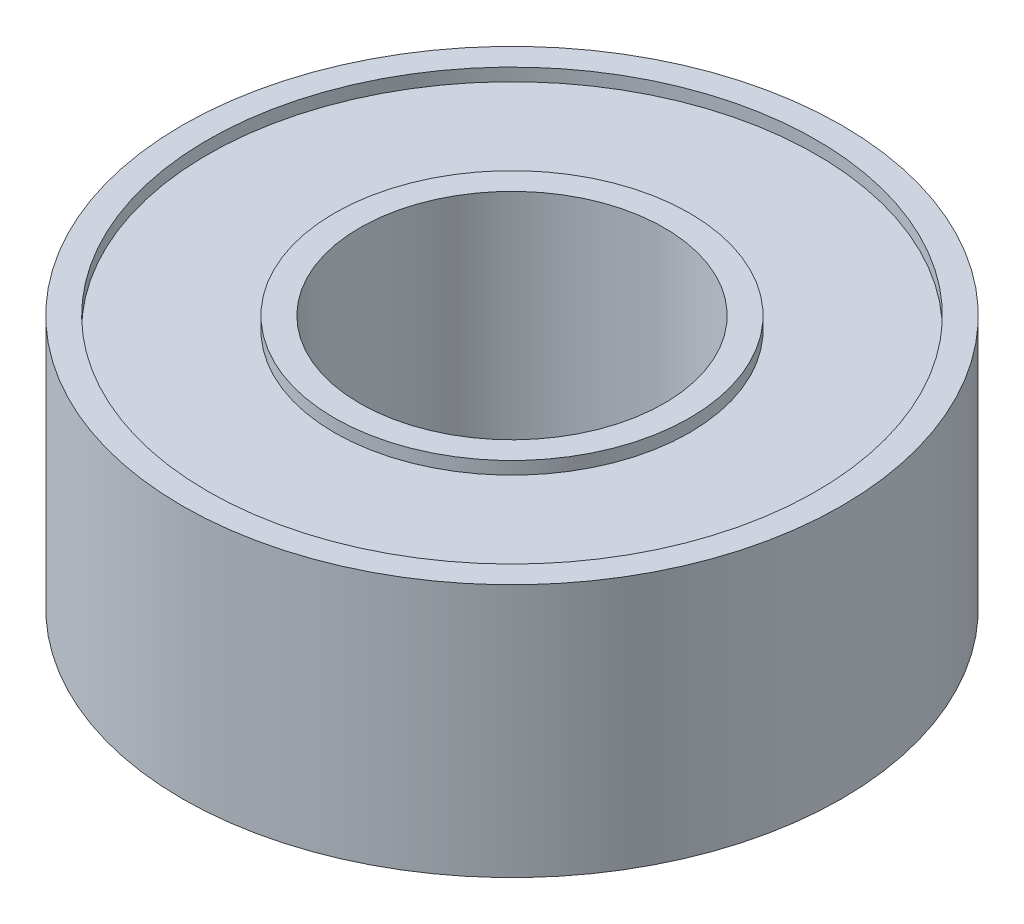
ISO-10303-21;
HEADER;
FILE_DESCRIPTION(('STEP AP214'),'2;1');
FILE_NAME('part.step','',(''),(''),'','','');
FILE_SCHEMA(('AUTOMOTIVE_DESIGN { 1 0 10303 214 1 1 1 1 }'));
ENDSEC;
DATA;
#1=APPLICATION_CONTEXT('core data for automotive mechanical design processes');
#2=APPLICATION_PROTOCOL_DEFINITION('international standard','automotive_design',2000,#1);
#3=PRODUCT_CONTEXT('',#1,'mechanical');
#4=PRODUCT('Part','Part','',(#3));
#5=PRODUCT_RELATED_PRODUCT_CATEGORY('part','',(#4));
#6=PRODUCT_DEFINITION_FORMATION('','',#4);
#7=PRODUCT_DEFINITION_CONTEXT('part definition',#1,'design');
#8=PRODUCT_DEFINITION('design','',#6,#7);
#9=PRODUCT_DEFINITION_SHAPE('','',#8);
#10=(LENGTH_UNIT() NAMED_UNIT(*) SI_UNIT(.MILLI.,.METRE.));
#11=(NAMED_UNIT(*) PLANE_ANGLE_UNIT() SI_UNIT($,.RADIAN.));
#12=(NAMED_UNIT(*) SI_UNIT($,.STERADIAN.) SOLID_ANGLE_UNIT());
#13=UNCERTAINTY_MEASURE_WITH_UNIT(LENGTH_MEASURE(1.E-05),#10,'distance_accuracy_value','');
#14=(GEOMETRIC_REPRESENTATION_CONTEXT(3) GLOBAL_UNCERTAINTY_ASSIGNED_CONTEXT((#13)) GLOBAL_UNIT_ASSIGNED_CONTEXT((#10,
#11,#12)) REPRESENTATION_CONTEXT('',''));
#15=CARTESIAN_POINT('',(0.,0.,0.));
#16=DIRECTION('',(0.,0.,1.));
#17=DIRECTION('',(1.,0.,0.));
#18=AXIS2_PLACEMENT_3D('',#15,#16,#17);
#19=CARTESIAN_POINT('',(0.,0.,0.));
#20=DIRECTION('',(0.,1.,0.));
#21=DIRECTION('',(0.,0.,1.));
#22=AXIS2_PLACEMENT_3D('',#19,#20,#21);
#23=PLANE('',#22);
#24=CARTESIAN_POINT('',(0.,0.,0.));
#25=DIRECTION('',(0.,1.,0.));
#26=DIRECTION('',(0.,0.,1.));
#27=AXIS2_PLACEMENT_3D('',#24,#25,#26);
#28=CIRCLE('',#27,6.);
#29=CARTESIAN_POINT('',(0.,0.,6.));
#30=VERTEX_POINT('',#29);
#31=EDGE_CURVE('E68',#30,#30,#28,.T.);
#32=ORIENTED_EDGE('',*,*,#31,.T.);
#33=EDGE_LOOP('',(#32));
#34=FACE_BOUND('',#33,.T.);
#35=CARTESIAN_POINT('',(0.,0.,0.));
#36=DIRECTION('',(0.,1.,0.));
#37=DIRECTION('',(0.,0.,1.));
#38=AXIS2_PLACEMENT_3D('',#35,#36,#37);
#39=CIRCLE('',#38,6.5);
#40=CARTESIAN_POINT('',(0.,0.,6.5));
#41=VERTEX_POINT('',#40);
#42=EDGE_CURVE('E33',#41,#41,#39,.T.);
#43=ORIENTED_EDGE('',*,*,#42,.F.);
#44=EDGE_LOOP('',(#43));
#45=FACE_BOUND('',#44,.T.);
#46=ADVANCED_FACE('F29',(#34,#45),#23,.F.);
#47=CARTESIAN_POINT('',(0.,5.,0.));
#48=DIRECTION('',(0.,1.,0.));
#49=DIRECTION('',(0.,0.,1.));
#50=AXIS2_PLACEMENT_3D('',#47,#48,#49);
#51=PLANE('',#50);
#52=CARTESIAN_POINT('',(0.,5.,0.));
#53=DIRECTION('',(0.,1.,0.));
#54=DIRECTION('',(0.,0.,1.));
#55=AXIS2_PLACEMENT_3D('',#52,#53,#54);
#56=CIRCLE('',#55,6.);
#57=CARTESIAN_POINT('',(0.,5.,6.));
#58=VERTEX_POINT('',#57);
#59=EDGE_CURVE('E56',#58,#58,#56,.T.);
#60=ORIENTED_EDGE('',*,*,#59,.F.);
#61=EDGE_LOOP('',(#60));
#62=FACE_BOUND('',#61,.T.);
#63=CARTESIAN_POINT('',(0.,5.,0.));
#64=DIRECTION('',(0.,1.,0.));
#65=DIRECTION('',(0.,0.,1.));
#66=AXIS2_PLACEMENT_3D('',#63,#64,#65);
#67=CIRCLE('',#66,6.5);
#68=CARTESIAN_POINT('',(0.,5.,6.5));
#69=VERTEX_POINT('',#68);
#70=EDGE_CURVE('E10',#69,#69,#67,.T.);
#71=ORIENTED_EDGE('',*,*,#70,.T.);
#72=EDGE_LOOP('',(#71));
#73=FACE_BOUND('',#72,.T.);
#74=ADVANCED_FACE('F114',(#62,#73),#51,.T.);
#75=CARTESIAN_POINT('',(0.,5.,0.));
#76=DIRECTION('',(0.,1.,0.));
#77=DIRECTION('',(0.,0.,1.));
#78=AXIS2_PLACEMENT_3D('',#75,#76,#77);
#79=CIRCLE('',#78,3.5);
#80=CARTESIAN_POINT('',(0.,5.,3.5));
#81=VERTEX_POINT('',#80);
#82=EDGE_CURVE('E53',#81,#81,#79,.T.);
#83=ORIENTED_EDGE('',*,*,#82,.T.);
#84=EDGE_LOOP('',(#83));
#85=FACE_BOUND('',#84,.T.);
#86=CARTESIAN_POINT('',(0.,5.,0.));
#87=DIRECTION('',(0.,1.,0.));
#88=DIRECTION('',(0.,0.,1.));
#89=AXIS2_PLACEMENT_3D('',#86,#87,#88);
#90=CIRCLE('',#89,3.);
#91=CARTESIAN_POINT('',(0.,5.,3.));
#92=VERTEX_POINT('',#91);
#93=EDGE_CURVE('E40',#92,#92,#90,.T.);
#94=ORIENTED_EDGE('',*,*,#93,.F.);
#95=EDGE_LOOP('',(#94));
#96=FACE_BOUND('',#95,.T.);
#97=ADVANCED_FACE('F96',(#85,#96),#51,.T.);
#98=CARTESIAN_POINT('',(0.,0.,0.));
#99=DIRECTION('',(0.,1.,0.));
#100=DIRECTION('',(0.,0.,1.));
#101=AXIS2_PLACEMENT_3D('',#98,#99,#100);
#102=CIRCLE('',#101,3.5);
#103=CARTESIAN_POINT('',(0.,0.,3.5));
#104=VERTEX_POINT('',#103);
#105=EDGE_CURVE('E65',#104,#104,#102,.T.);
#106=ORIENTED_EDGE('',*,*,#105,.F.);
#107=EDGE_LOOP('',(#106));
#108=FACE_BOUND('',#107,.T.);
#109=CARTESIAN_POINT('',(0.,0.,0.));
#110=DIRECTION('',(0.,1.,0.));
#111=DIRECTION('',(0.,0.,1.));
#112=AXIS2_PLACEMENT_3D('',#109,#110,#111);
#113=CIRCLE('',#112,3.);
#114=CARTESIAN_POINT('',(0.,0.,3.));
#115=VERTEX_POINT('',#114);
#116=EDGE_CURVE('E42',#115,#115,#113,.T.);
#117=ORIENTED_EDGE('',*,*,#116,.T.);
#118=EDGE_LOOP('',(#117));
#119=FACE_BOUND('',#118,.T.);
#120=ADVANCED_FACE('F93',(#108,#119),#23,.F.);
#121=CARTESIAN_POINT('',(0.,5.,0.));
#122=DIRECTION('',(0.,-1.,0.));
#123=DIRECTION('',(0.,0.,-1.));
#124=AXIS2_PLACEMENT_3D('',#121,#122,#123);
#125=CYLINDRICAL_SURFACE('',#124,6.5);
#126=ORIENTED_EDGE('',*,*,#70,.F.);
#127=EDGE_LOOP('',(#126));
#128=FACE_BOUND('',#127,.T.);
#129=ORIENTED_EDGE('',*,*,#42,.T.);
#130=EDGE_LOOP('',(#129));
#131=FACE_BOUND('',#130,.T.);
#132=ADVANCED_FACE('F31',(#128,#131),#125,.T.);
#133=CARTESIAN_POINT('',(0.,5.,0.));
#134=DIRECTION('',(0.,-1.,0.));
#135=DIRECTION('',(0.,0.,-1.));
#136=AXIS2_PLACEMENT_3D('',#133,#134,#135);
#137=CYLINDRICAL_SURFACE('',#136,3.);
#138=ORIENTED_EDGE('',*,*,#93,.T.);
#139=EDGE_LOOP('',(#138));
#140=FACE_BOUND('',#139,.T.);
#141=ORIENTED_EDGE('',*,*,#116,.F.);
#142=EDGE_LOOP('',(#141));
#143=FACE_BOUND('',#142,.T.);
#144=ADVANCED_FACE('F99',(#140,#143),#137,.F.);
#145=CARTESIAN_POINT('',(0.,5.,0.));
#146=DIRECTION('',(0.,1.,0.));
#147=DIRECTION('',(0.,0.,1.));
#148=AXIS2_PLACEMENT_3D('',#145,#146,#147);
#149=CYLINDRICAL_SURFACE('',#148,6.);
#150=CARTESIAN_POINT('',(0.,4.75,0.));
#151=DIRECTION('',(0.,1.,0.));
#152=DIRECTION('',(0.,0.,1.));
#153=AXIS2_PLACEMENT_3D('',#150,#151,#152);
#154=CIRCLE('',#153,6.);
#155=CARTESIAN_POINT('',(0.,4.75,6.));
#156=VERTEX_POINT('',#155);
#157=EDGE_CURVE('E45',#156,#156,#154,.T.);
#158=ORIENTED_EDGE('',*,*,#157,.F.);
#159=EDGE_LOOP('',(#158));
#160=FACE_BOUND('',#159,.T.);
#161=ORIENTED_EDGE('',*,*,#59,.T.);
#162=EDGE_LOOP('',(#161));
#163=FACE_BOUND('',#162,.T.);
#164=ADVANCED_FACE('F101',(#160,#163),#149,.F.);
#165=CARTESIAN_POINT('',(-6.,4.75,0.));
#166=DIRECTION('',(0.,-1.,0.));
#167=DIRECTION('',(0.,0.,-1.));
#168=AXIS2_PLACEMENT_3D('',#165,#166,#167);
#169=PLANE('',#168);
#170=CARTESIAN_POINT('',(0.,4.75,0.));
#171=DIRECTION('',(0.,1.,0.));
#172=DIRECTION('',(0.,0.,1.));
#173=AXIS2_PLACEMENT_3D('',#170,#171,#172);
#174=CIRCLE('',#173,3.5);
#175=CARTESIAN_POINT('',(0.,4.75,3.5));
#176=VERTEX_POINT('',#175);
#177=EDGE_CURVE('E50',#176,#176,#174,.T.);
#178=ORIENTED_EDGE('',*,*,#177,.F.);
#179=EDGE_LOOP('',(#178));
#180=FACE_BOUND('',#179,.T.);
#181=ORIENTED_EDGE('',*,*,#157,.T.);
#182=EDGE_LOOP('',(#181));
#183=FACE_BOUND('',#182,.T.);
#184=ADVANCED_FACE('F108',(#180,#183),#169,.F.);
#185=CARTESIAN_POINT('',(0.,5.,0.));
#186=DIRECTION('',(0.,1.,0.));
#187=DIRECTION('',(0.,0.,1.));
#188=AXIS2_PLACEMENT_3D('',#185,#186,#187);
#189=CYLINDRICAL_SURFACE('',#188,3.5);
#190=ORIENTED_EDGE('',*,*,#82,.F.);
#191=EDGE_LOOP('',(#190));
#192=FACE_BOUND('',#191,.T.);
#193=ORIENTED_EDGE('',*,*,#177,.T.);
#194=EDGE_LOOP('',(#193));
#195=FACE_BOUND('',#194,.T.);
#196=ADVANCED_FACE('F78',(#192,#195),#189,.T.);
#197=CARTESIAN_POINT('',(0.,5.,0.));
#198=DIRECTION('',(0.,1.,0.));
#199=DIRECTION('',(0.,0.,1.));
#200=AXIS2_PLACEMENT_3D('',#197,#198,#199);
#201=CYLINDRICAL_SURFACE('',#200,6.);
#202=ORIENTED_EDGE('',*,*,#31,.F.);
#203=EDGE_LOOP('',(#202));
#204=FACE_BOUND('',#203,.T.);
#205=CARTESIAN_POINT('',(0.,0.25,0.));
#206=DIRECTION('',(0.,1.,0.));
#207=DIRECTION('',(0.,0.,1.));
#208=AXIS2_PLACEMENT_3D('',#205,#206,#207);
#209=CIRCLE('',#208,6.);
#210=CARTESIAN_POINT('',(0.,0.25,6.));
#211=VERTEX_POINT('',#210);
#212=EDGE_CURVE('E59',#211,#211,#209,.T.);
#213=ORIENTED_EDGE('',*,*,#212,.T.);
#214=EDGE_LOOP('',(#213));
#215=FACE_BOUND('',#214,.T.);
#216=ADVANCED_FACE('F74',(#204,#215),#201,.F.);
#217=CARTESIAN_POINT('',(-6.,0.25,0.));
#218=DIRECTION('',(0.,1.,0.));
#219=DIRECTION('',(0.,0.,1.));
#220=AXIS2_PLACEMENT_3D('',#217,#218,#219);
#221=PLANE('',#220);
#222=ORIENTED_EDGE('',*,*,#212,.F.);
#223=EDGE_LOOP('',(#222));
#224=FACE_BOUND('',#223,.T.);
#225=CARTESIAN_POINT('',(0.,0.25,0.));
#226=DIRECTION('',(0.,1.,0.));
#227=DIRECTION('',(0.,0.,1.));
#228=AXIS2_PLACEMENT_3D('',#225,#226,#227);
#229=CIRCLE('',#228,3.5);
#230=CARTESIAN_POINT('',(0.,0.25,3.5));
#231=VERTEX_POINT('',#230);
#232=EDGE_CURVE('E62',#231,#231,#229,.T.);
#233=ORIENTED_EDGE('',*,*,#232,.T.);
#234=EDGE_LOOP('',(#233));
#235=FACE_BOUND('',#234,.T.);
#236=ADVANCED_FACE('F77',(#224,#235),#221,.F.);
#237=CARTESIAN_POINT('',(0.,5.,0.));
#238=DIRECTION('',(0.,1.,0.));
#239=DIRECTION('',(0.,0.,1.));
#240=AXIS2_PLACEMENT_3D('',#237,#238,#239);
#241=CYLINDRICAL_SURFACE('',#240,3.5);
#242=ORIENTED_EDGE('',*,*,#232,.F.);
#243=EDGE_LOOP('',(#242));
#244=FACE_BOUND('',#243,.T.);
#245=ORIENTED_EDGE('',*,*,#105,.T.);
#246=EDGE_LOOP('',(#245));
#247=FACE_BOUND('',#246,.T.);
#248=ADVANCED_FACE('F84',(#244,#247),#241,.T.);
#249=CLOSED_SHELL('',(#46,#74,#97,#120,#132,#144,#164,#184,#196,#216,#236,#248));
#250=MANIFOLD_SOLID_BREP('B2',#249);
#251=ADVANCED_BREP_SHAPE_REPRESENTATION('',(#18,#250),#14);
#252=SHAPE_DEFINITION_REPRESENTATION(#9,#251);
ENDSEC;
END-ISO-10303-21;
